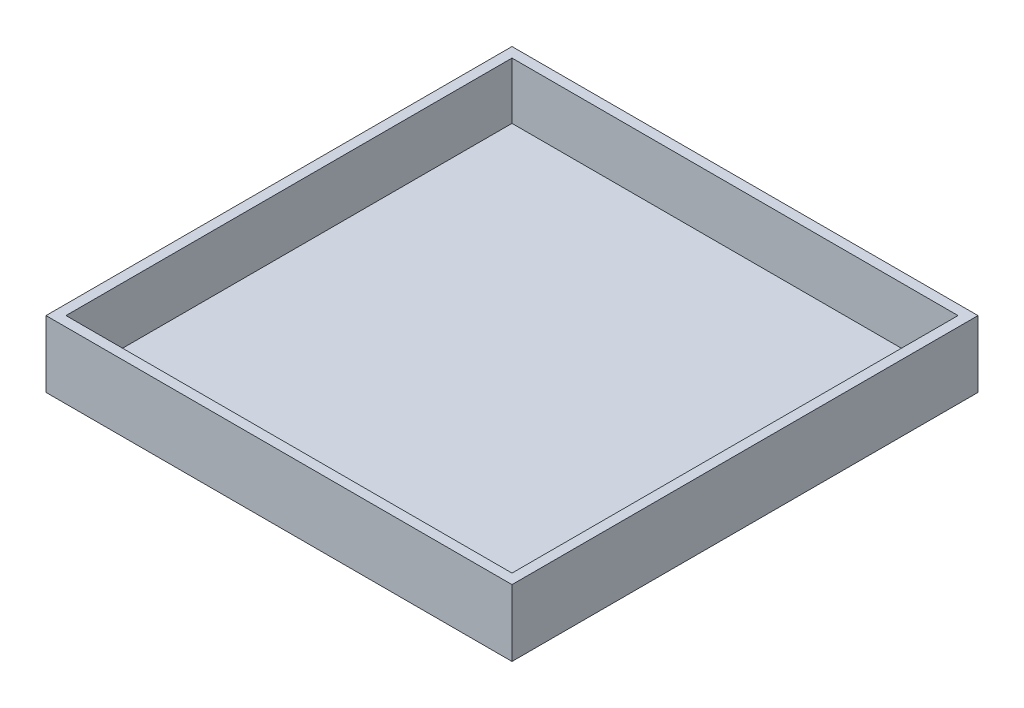
ISO-10303-21;
HEADER;
FILE_DESCRIPTION(('STEP AP214'),'2;1');
FILE_NAME('part.step','',(''),(''),'','','');
FILE_SCHEMA(('AUTOMOTIVE_DESIGN { 1 0 10303 214 1 1 1 1 }'));
ENDSEC;
DATA;
#1=APPLICATION_CONTEXT('core data for automotive mechanical design processes');
#2=APPLICATION_PROTOCOL_DEFINITION('international standard','automotive_design',2000,#1);
#3=PRODUCT_CONTEXT('',#1,'mechanical');
#4=PRODUCT('Part','Part','',(#3));
#5=PRODUCT_RELATED_PRODUCT_CATEGORY('part','',(#4));
#6=PRODUCT_DEFINITION_FORMATION('','',#4);
#7=PRODUCT_DEFINITION_CONTEXT('part definition',#1,'design');
#8=PRODUCT_DEFINITION('design','',#6,#7);
#9=PRODUCT_DEFINITION_SHAPE('','',#8);
#10=(LENGTH_UNIT() NAMED_UNIT(*) SI_UNIT(.MILLI.,.METRE.));
#11=(NAMED_UNIT(*) PLANE_ANGLE_UNIT() SI_UNIT($,.RADIAN.));
#12=(NAMED_UNIT(*) SI_UNIT($,.STERADIAN.) SOLID_ANGLE_UNIT());
#13=UNCERTAINTY_MEASURE_WITH_UNIT(LENGTH_MEASURE(1.E-05),#10,'distance_accuracy_value','');
#14=(GEOMETRIC_REPRESENTATION_CONTEXT(3) GLOBAL_UNCERTAINTY_ASSIGNED_CONTEXT((#13)) GLOBAL_UNIT_ASSIGNED_CONTEXT((#10,
#11,#12)) REPRESENTATION_CONTEXT('',''));
#15=CARTESIAN_POINT('',(0.,0.,0.));
#16=DIRECTION('',(0.,0.,1.));
#17=DIRECTION('',(1.,0.,0.));
#18=AXIS2_PLACEMENT_3D('',#15,#16,#17);
#19=CARTESIAN_POINT('',(3.,3.,3.));
#20=DIRECTION('',(0.,1.,0.));
#21=DIRECTION('',(1.,0.,0.));
#22=AXIS2_PLACEMENT_3D('',#19,#20,#21);
#23=PLANE('',#22);
#24=DIRECTION('',(1.,0.,0.));
#25=VECTOR('',#24,1.);
#26=CARTESIAN_POINT('',(3.,3.,3.));
#27=LINE('',#26,#25);
#28=CARTESIAN_POINT('',(3.,3.,3.));
#29=VERTEX_POINT('',#28);
#30=CARTESIAN_POINT('',(137.,3.,3.));
#31=VERTEX_POINT('',#30);
#32=EDGE_CURVE('E25',#29,#31,#27,.T.);
#33=ORIENTED_EDGE('',*,*,#32,.F.);
#34=DIRECTION('',(0.,0.,1.));
#35=VECTOR('',#34,1.);
#36=CARTESIAN_POINT('',(3.,3.,3.));
#37=LINE('',#36,#35);
#38=CARTESIAN_POINT('',(3.,3.,137.));
#39=VERTEX_POINT('',#38);
#40=EDGE_CURVE('E10',#29,#39,#37,.T.);
#41=ORIENTED_EDGE('',*,*,#40,.T.);
#42=DIRECTION('',(1.,0.,0.));
#43=VECTOR('',#42,1.);
#44=CARTESIAN_POINT('',(3.,3.,137.));
#45=LINE('',#44,#43);
#46=CARTESIAN_POINT('',(137.,3.,137.));
#47=VERTEX_POINT('',#46);
#48=EDGE_CURVE('E140',#39,#47,#45,.T.);
#49=ORIENTED_EDGE('',*,*,#48,.T.);
#50=DIRECTION('',(0.,0.,1.));
#51=VECTOR('',#50,1.);
#52=CARTESIAN_POINT('',(137.,3.,3.));
#53=LINE('',#52,#51);
#54=EDGE_CURVE('E108',#31,#47,#53,.T.);
#55=ORIENTED_EDGE('',*,*,#54,.F.);
#56=EDGE_LOOP('',(#33,#41,#49,#55));
#57=FACE_BOUND('',#56,.T.);
#58=ADVANCED_FACE('F16',(#57),#23,.T.);
#59=CARTESIAN_POINT('',(3.,3.,3.));
#60=DIRECTION('',(1.,0.,0.));
#61=DIRECTION('',(0.,1.,0.));
#62=AXIS2_PLACEMENT_3D('',#59,#60,#61);
#63=PLANE('',#62);
#64=DIRECTION('',(0.,1.,0.));
#65=VECTOR('',#64,1.);
#66=CARTESIAN_POINT('',(3.,3.,137.));
#67=LINE('',#66,#65);
#68=CARTESIAN_POINT('',(3.,20.,137.));
#69=VERTEX_POINT('',#68);
#70=EDGE_CURVE('E143',#39,#69,#67,.T.);
#71=ORIENTED_EDGE('',*,*,#70,.F.);
#72=ORIENTED_EDGE('',*,*,#40,.F.);
#73=DIRECTION('',(0.,1.,0.));
#74=VECTOR('',#73,1.);
#75=CARTESIAN_POINT('',(3.,3.,3.));
#76=LINE('',#75,#74);
#77=CARTESIAN_POINT('',(3.,20.,3.));
#78=VERTEX_POINT('',#77);
#79=EDGE_CURVE('E101',#29,#78,#76,.T.);
#80=ORIENTED_EDGE('',*,*,#79,.T.);
#81=DIRECTION('',(0.,0.,-1.));
#82=VECTOR('',#81,1.);
#83=CARTESIAN_POINT('',(3.,20.,1.5));
#84=LINE('',#83,#82);
#85=EDGE_CURVE('E104',#69,#78,#84,.T.);
#86=ORIENTED_EDGE('',*,*,#85,.F.);
#87=EDGE_LOOP('',(#71,#72,#80,#86));
#88=FACE_BOUND('',#87,.T.);
#89=ADVANCED_FACE('F103',(#88),#63,.T.);
#90=CARTESIAN_POINT('',(3.,3.,3.));
#91=DIRECTION('',(0.,0.,1.));
#92=DIRECTION('',(1.,0.,0.));
#93=AXIS2_PLACEMENT_3D('',#90,#91,#92);
#94=PLANE('',#93);
#95=ORIENTED_EDGE('',*,*,#79,.F.);
#96=ORIENTED_EDGE('',*,*,#32,.T.);
#97=DIRECTION('',(0.,1.,0.));
#98=VECTOR('',#97,1.);
#99=CARTESIAN_POINT('',(137.,3.,3.));
#100=LINE('',#99,#98);
#101=CARTESIAN_POINT('',(137.,20.,3.));
#102=VERTEX_POINT('',#101);
#103=EDGE_CURVE('E113',#31,#102,#100,.T.);
#104=ORIENTED_EDGE('',*,*,#103,.T.);
#105=DIRECTION('',(1.,0.,0.));
#106=VECTOR('',#105,1.);
#107=CARTESIAN_POINT('',(1.5,20.,3.));
#108=LINE('',#107,#106);
#109=EDGE_CURVE('E115',#78,#102,#108,.T.);
#110=ORIENTED_EDGE('',*,*,#109,.F.);
#111=EDGE_LOOP('',(#95,#96,#104,#110));
#112=FACE_BOUND('',#111,.T.);
#113=ADVANCED_FACE('F114',(#112),#94,.T.);
#114=CARTESIAN_POINT('',(137.,3.,3.));
#115=DIRECTION('',(1.,0.,0.));
#116=DIRECTION('',(0.,1.,0.));
#117=AXIS2_PLACEMENT_3D('',#114,#115,#116);
#118=PLANE('',#117);
#119=DIRECTION('',(0.,0.,-1.));
#120=VECTOR('',#119,1.);
#121=CARTESIAN_POINT('',(137.,20.,1.5));
#122=LINE('',#121,#120);
#123=CARTESIAN_POINT('',(137.,20.,137.));
#124=VERTEX_POINT('',#123);
#125=EDGE_CURVE('E119',#124,#102,#122,.T.);
#126=ORIENTED_EDGE('',*,*,#125,.T.);
#127=ORIENTED_EDGE('',*,*,#103,.F.);
#128=ORIENTED_EDGE('',*,*,#54,.T.);
#129=DIRECTION('',(0.,1.,0.));
#130=VECTOR('',#129,1.);
#131=CARTESIAN_POINT('',(137.,3.,137.));
#132=LINE('',#131,#130);
#133=EDGE_CURVE('E92',#47,#124,#132,.T.);
#134=ORIENTED_EDGE('',*,*,#133,.T.);
#135=EDGE_LOOP('',(#126,#127,#128,#134));
#136=FACE_BOUND('',#135,.T.);
#137=ADVANCED_FACE('F155',(#136),#118,.F.);
#138=CARTESIAN_POINT('',(3.,3.,137.));
#139=DIRECTION('',(0.,0.,1.));
#140=DIRECTION('',(1.,0.,0.));
#141=AXIS2_PLACEMENT_3D('',#138,#139,#140);
#142=PLANE('',#141);
#143=DIRECTION('',(1.,0.,0.));
#144=VECTOR('',#143,1.);
#145=CARTESIAN_POINT('',(1.5,20.,137.));
#146=LINE('',#145,#144);
#147=EDGE_CURVE('E123',#69,#124,#146,.T.);
#148=ORIENTED_EDGE('',*,*,#147,.T.);
#149=ORIENTED_EDGE('',*,*,#133,.F.);
#150=ORIENTED_EDGE('',*,*,#48,.F.);
#151=ORIENTED_EDGE('',*,*,#70,.T.);
#152=EDGE_LOOP('',(#148,#149,#150,#151));
#153=FACE_BOUND('',#152,.T.);
#154=ADVANCED_FACE('F152',(#153),#142,.F.);
#155=CARTESIAN_POINT('',(140.,0.,0.));
#156=DIRECTION('',(1.,0.,0.));
#157=DIRECTION('',(0.,1.,0.));
#158=AXIS2_PLACEMENT_3D('',#155,#156,#157);
#159=PLANE('',#158);
#160=DIRECTION('',(0.,0.,1.));
#161=VECTOR('',#160,1.);
#162=CARTESIAN_POINT('',(140.,0.,0.));
#163=LINE('',#162,#161);
#164=CARTESIAN_POINT('',(140.,0.,0.));
#165=VERTEX_POINT('',#164);
#166=CARTESIAN_POINT('',(140.,0.,140.));
#167=VERTEX_POINT('',#166);
#168=EDGE_CURVE('E197',#165,#167,#163,.T.);
#169=ORIENTED_EDGE('',*,*,#168,.F.);
#170=DIRECTION('',(0.,1.,0.));
#171=VECTOR('',#170,1.);
#172=CARTESIAN_POINT('',(140.,0.,0.));
#173=LINE('',#172,#171);
#174=CARTESIAN_POINT('',(140.,20.,0.));
#175=VERTEX_POINT('',#174);
#176=EDGE_CURVE('E133',#165,#175,#173,.T.);
#177=ORIENTED_EDGE('',*,*,#176,.T.);
#178=DIRECTION('',(0.,0.,1.));
#179=VECTOR('',#178,1.);
#180=CARTESIAN_POINT('',(140.,20.,0.));
#181=LINE('',#180,#179);
#182=CARTESIAN_POINT('',(140.,20.,140.));
#183=VERTEX_POINT('',#182);
#184=EDGE_CURVE('E127',#175,#183,#181,.T.);
#185=ORIENTED_EDGE('',*,*,#184,.T.);
#186=DIRECTION('',(0.,1.,0.));
#187=VECTOR('',#186,1.);
#188=CARTESIAN_POINT('',(140.,0.,140.));
#189=LINE('',#188,#187);
#190=EDGE_CURVE('E170',#167,#183,#189,.T.);
#191=ORIENTED_EDGE('',*,*,#190,.F.);
#192=EDGE_LOOP('',(#169,#177,#185,#191));
#193=FACE_BOUND('',#192,.T.);
#194=ADVANCED_FACE('F183',(#193),#159,.T.);
#195=CARTESIAN_POINT('',(0.,0.,0.));
#196=DIRECTION('',(0.,0.,1.));
#197=DIRECTION('',(1.,0.,0.));
#198=AXIS2_PLACEMENT_3D('',#195,#196,#197);
#199=PLANE('',#198);
#200=DIRECTION('',(1.,0.,0.));
#201=VECTOR('',#200,1.);
#202=CARTESIAN_POINT('',(0.,20.,0.));
#203=LINE('',#202,#201);
#204=CARTESIAN_POINT('',(0.,20.,0.));
#205=VERTEX_POINT('',#204);
#206=EDGE_CURVE('E175',#205,#175,#203,.T.);
#207=ORIENTED_EDGE('',*,*,#206,.T.);
#208=ORIENTED_EDGE('',*,*,#176,.F.);
#209=DIRECTION('',(1.,0.,0.));
#210=VECTOR('',#209,1.);
#211=CARTESIAN_POINT('',(0.,0.,0.));
#212=LINE('',#211,#210);
#213=CARTESIAN_POINT('',(0.,0.,0.));
#214=VERTEX_POINT('',#213);
#215=EDGE_CURVE('E163',#214,#165,#212,.T.);
#216=ORIENTED_EDGE('',*,*,#215,.F.);
#217=DIRECTION('',(0.,1.,0.));
#218=VECTOR('',#217,1.);
#219=CARTESIAN_POINT('',(0.,0.,0.));
#220=LINE('',#219,#218);
#221=EDGE_CURVE('E201',#214,#205,#220,.T.);
#222=ORIENTED_EDGE('',*,*,#221,.T.);
#223=EDGE_LOOP('',(#207,#208,#216,#222));
#224=FACE_BOUND('',#223,.T.);
#225=ADVANCED_FACE('F220',(#224),#199,.F.);
#226=CARTESIAN_POINT('',(0.,20.,0.));
#227=DIRECTION('',(0.,1.,0.));
#228=DIRECTION('',(1.,0.,0.));
#229=AXIS2_PLACEMENT_3D('',#226,#227,#228);
#230=PLANE('',#229);
#231=ORIENTED_EDGE('',*,*,#147,.F.);
#232=ORIENTED_EDGE('',*,*,#85,.T.);
#233=ORIENTED_EDGE('',*,*,#109,.T.);
#234=ORIENTED_EDGE('',*,*,#125,.F.);
#235=EDGE_LOOP('',(#231,#232,#233,#234));
#236=FACE_BOUND('',#235,.T.);
#237=ORIENTED_EDGE('',*,*,#206,.F.);
#238=DIRECTION('',(0.,0.,1.));
#239=VECTOR('',#238,1.);
#240=CARTESIAN_POINT('',(0.,20.,0.));
#241=LINE('',#240,#239);
#242=CARTESIAN_POINT('',(0.,20.,140.));
#243=VERTEX_POINT('',#242);
#244=EDGE_CURVE('E190',#205,#243,#241,.T.);
#245=ORIENTED_EDGE('',*,*,#244,.T.);
#246=DIRECTION('',(1.,0.,0.));
#247=VECTOR('',#246,1.);
#248=CARTESIAN_POINT('',(0.,20.,140.));
#249=LINE('',#248,#247);
#250=EDGE_CURVE('E171',#243,#183,#249,.T.);
#251=ORIENTED_EDGE('',*,*,#250,.T.);
#252=ORIENTED_EDGE('',*,*,#184,.F.);
#253=EDGE_LOOP('',(#237,#245,#251,#252));
#254=FACE_BOUND('',#253,.T.);
#255=ADVANCED_FACE('F120',(#236,#254),#230,.T.);
#256=CARTESIAN_POINT('',(0.,0.,140.));
#257=DIRECTION('',(0.,0.,1.));
#258=DIRECTION('',(1.,0.,0.));
#259=AXIS2_PLACEMENT_3D('',#256,#257,#258);
#260=PLANE('',#259);
#261=DIRECTION('',(0.,1.,0.));
#262=VECTOR('',#261,1.);
#263=CARTESIAN_POINT('',(0.,0.,140.));
#264=LINE('',#263,#262);
#265=CARTESIAN_POINT('',(0.,0.,140.));
#266=VERTEX_POINT('',#265);
#267=EDGE_CURVE('E193',#266,#243,#264,.T.);
#268=ORIENTED_EDGE('',*,*,#267,.F.);
#269=DIRECTION('',(1.,0.,0.));
#270=VECTOR('',#269,1.);
#271=CARTESIAN_POINT('',(0.,0.,140.));
#272=LINE('',#271,#270);
#273=EDGE_CURVE('E165',#266,#167,#272,.T.);
#274=ORIENTED_EDGE('',*,*,#273,.T.);
#275=ORIENTED_EDGE('',*,*,#190,.T.);
#276=ORIENTED_EDGE('',*,*,#250,.F.);
#277=EDGE_LOOP('',(#268,#274,#275,#276));
#278=FACE_BOUND('',#277,.T.);
#279=ADVANCED_FACE('F191',(#278),#260,.T.);
#280=CARTESIAN_POINT('',(0.,0.,0.));
#281=DIRECTION('',(0.,1.,0.));
#282=DIRECTION('',(1.,0.,0.));
#283=AXIS2_PLACEMENT_3D('',#280,#281,#282);
#284=PLANE('',#283);
#285=ORIENTED_EDGE('',*,*,#168,.T.);
#286=ORIENTED_EDGE('',*,*,#273,.F.);
#287=DIRECTION('',(0.,0.,1.));
#288=VECTOR('',#287,1.);
#289=CARTESIAN_POINT('',(0.,0.,0.));
#290=LINE('',#289,#288);
#291=EDGE_CURVE('E199',#214,#266,#290,.T.);
#292=ORIENTED_EDGE('',*,*,#291,.F.);
#293=ORIENTED_EDGE('',*,*,#215,.T.);
#294=EDGE_LOOP('',(#285,#286,#292,#293));
#295=FACE_BOUND('',#294,.T.);
#296=ADVANCED_FACE('F196',(#295),#284,.F.);
#297=CARTESIAN_POINT('',(0.,0.,0.));
#298=DIRECTION('',(1.,0.,0.));
#299=DIRECTION('',(0.,1.,0.));
#300=AXIS2_PLACEMENT_3D('',#297,#298,#299);
#301=PLANE('',#300);
#302=ORIENTED_EDGE('',*,*,#267,.T.);
#303=ORIENTED_EDGE('',*,*,#244,.F.);
#304=ORIENTED_EDGE('',*,*,#221,.F.);
#305=ORIENTED_EDGE('',*,*,#291,.T.);
#306=EDGE_LOOP('',(#302,#303,#304,#305));
#307=FACE_BOUND('',#306,.T.);
#308=ADVANCED_FACE('F212',(#307),#301,.F.);
#309=CLOSED_SHELL('',(#58,#89,#113,#137,#154,#194,#225,#255,#279,#296,#308));
#310=MANIFOLD_SOLID_BREP('B1',#309);
#311=ADVANCED_BREP_SHAPE_REPRESENTATION('',(#18,#310),#14);
#312=SHAPE_DEFINITION_REPRESENTATION(#9,#311);
ENDSEC;
END-ISO-10303-21;
